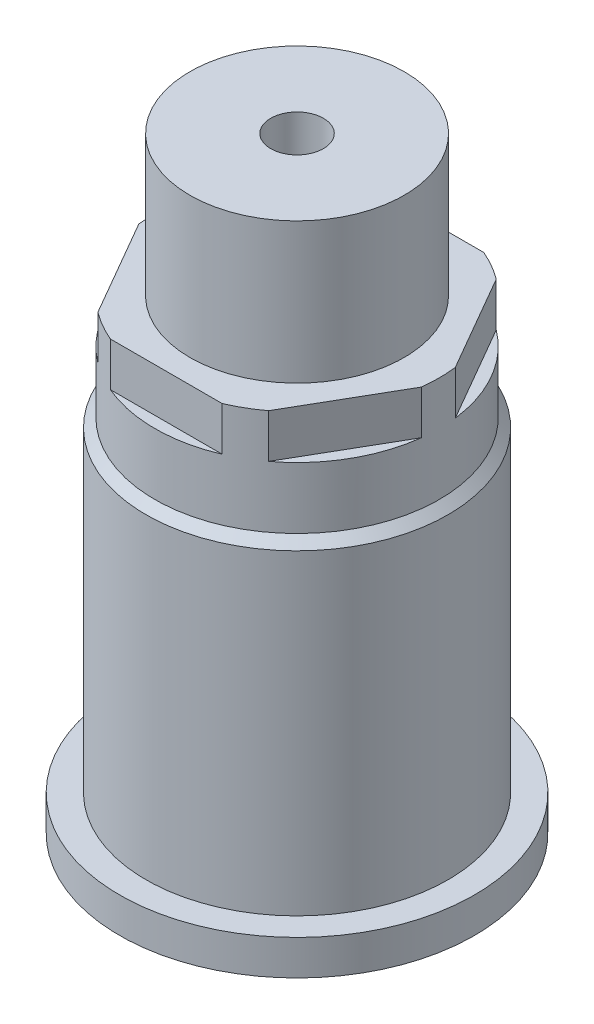
ISO-10303-21;
HEADER;
FILE_DESCRIPTION(('STEP AP214'),'2;1');
FILE_NAME('part.step','',(''),(''),'','','');
FILE_SCHEMA(('AUTOMOTIVE_DESIGN { 1 0 10303 214 1 1 1 1 }'));
ENDSEC;
DATA;
#1=APPLICATION_CONTEXT('core data for automotive mechanical design processes');
#2=APPLICATION_PROTOCOL_DEFINITION('international standard','automotive_design',2000,#1);
#3=PRODUCT_CONTEXT('',#1,'mechanical');
#4=PRODUCT('Part','Part','',(#3));
#5=PRODUCT_RELATED_PRODUCT_CATEGORY('part','',(#4));
#6=PRODUCT_DEFINITION_FORMATION('','',#4);
#7=PRODUCT_DEFINITION_CONTEXT('part definition',#1,'design');
#8=PRODUCT_DEFINITION('design','',#6,#7);
#9=PRODUCT_DEFINITION_SHAPE('','',#8);
#10=(LENGTH_UNIT() NAMED_UNIT(*) SI_UNIT(.MILLI.,.METRE.));
#11=(NAMED_UNIT(*) PLANE_ANGLE_UNIT() SI_UNIT($,.RADIAN.));
#12=(NAMED_UNIT(*) SI_UNIT($,.STERADIAN.) SOLID_ANGLE_UNIT());
#13=UNCERTAINTY_MEASURE_WITH_UNIT(LENGTH_MEASURE(1.E-05),#10,'distance_accuracy_value','');
#14=(GEOMETRIC_REPRESENTATION_CONTEXT(3) GLOBAL_UNCERTAINTY_ASSIGNED_CONTEXT((#13)) GLOBAL_UNIT_ASSIGNED_CONTEXT((#10,
#11,#12)) REPRESENTATION_CONTEXT('',''));
#15=CARTESIAN_POINT('',(0.,0.,0.));
#16=DIRECTION('',(0.,0.,1.));
#17=DIRECTION('',(1.,0.,0.));
#18=AXIS2_PLACEMENT_3D('',#15,#16,#17);
#19=CARTESIAN_POINT('',(0.,0.,0.));
#20=DIRECTION('',(0.,-1.,0.));
#21=DIRECTION('',(0.,0.,-1.));
#22=AXIS2_PLACEMENT_3D('',#19,#20,#21);
#23=CYLINDRICAL_SURFACE('',#22,10.287);
#24=CARTESIAN_POINT('',(0.,24.765,0.));
#25=DIRECTION('',(0.,-1.,0.));
#26=DIRECTION('',(0.,0.,-1.));
#27=AXIS2_PLACEMENT_3D('',#24,#25,#26);
#28=CIRCLE('',#27,10.287);
#29=CARTESIAN_POINT('',(0.,24.765,-10.287));
#30=VERTEX_POINT('',#29);
#31=EDGE_CURVE('E161',#30,#30,#28,.T.);
#32=ORIENTED_EDGE('',*,*,#31,.F.);
#33=EDGE_LOOP('',(#32));
#34=FACE_BOUND('',#33,.T.);
#35=CARTESIAN_POINT('',(0.,29.21,0.));
#36=DIRECTION('',(0.,1.,0.));
#37=DIRECTION('',(0.,0.,1.));
#38=AXIS2_PLACEMENT_3D('',#35,#36,#37);
#39=CIRCLE('',#38,10.287);
#40=CARTESIAN_POINT('',(-10.2135537826675,29.21,-1.22706484284985));
#41=VERTEX_POINT('',#40);
#42=CARTESIAN_POINT('',(-6.16944621733249,29.21,-8.23166461728379));
#43=VERTEX_POINT('',#42);
#44=EDGE_CURVE('E11',#41,#43,#39,.F.);
#45=ORIENTED_EDGE('',*,*,#44,.T.);
#46=DIRECTION('',(0.,-1.,0.));
#47=VECTOR('',#46,1.);
#48=CARTESIAN_POINT('',(-6.16944621733249,0.,-8.23166461728379));
#49=LINE('',#48,#47);
#50=CARTESIAN_POINT('',(-6.16944621733249,32.385,-8.23166461728379));
#51=VERTEX_POINT('',#50);
#52=EDGE_CURVE('E236',#43,#51,#49,.F.);
#53=ORIENTED_EDGE('',*,*,#52,.T.);
#54=CARTESIAN_POINT('',(0.,32.385,0.));
#55=DIRECTION('',(0.,-1.,0.));
#56=DIRECTION('',(0.,0.,-1.));
#57=AXIS2_PLACEMENT_3D('',#54,#55,#56);
#58=CIRCLE('',#57,10.287);
#59=CARTESIAN_POINT('',(-4.04410756533502,32.385,-9.45872946013364));
#60=VERTEX_POINT('',#59);
#61=EDGE_CURVE('E152',#51,#60,#58,.T.);
#62=ORIENTED_EDGE('',*,*,#61,.T.);
#63=DIRECTION('',(0.,-1.,0.));
#64=VECTOR('',#63,1.);
#65=CARTESIAN_POINT('',(-4.04410756533502,0.,-9.45872946013364));
#66=LINE('',#65,#64);
#67=CARTESIAN_POINT('',(-4.04410756533502,29.21,-9.45872946013364));
#68=VERTEX_POINT('',#67);
#69=EDGE_CURVE('E52',#60,#68,#66,.T.);
#70=ORIENTED_EDGE('',*,*,#69,.T.);
#71=CARTESIAN_POINT('',(4.04410756533502,29.21,-9.45872946013364));
#72=VERTEX_POINT('',#71);
#73=EDGE_CURVE('E44',#68,#72,#39,.F.);
#74=ORIENTED_EDGE('',*,*,#73,.T.);
#75=DIRECTION('',(0.,-1.,0.));
#76=VECTOR('',#75,1.);
#77=CARTESIAN_POINT('',(4.04410756533502,0.,-9.45872946013364));
#78=LINE('',#77,#76);
#79=CARTESIAN_POINT('',(4.04410756533502,32.385,-9.45872946013364));
#80=VERTEX_POINT('',#79);
#81=EDGE_CURVE('E207',#72,#80,#78,.F.);
#82=ORIENTED_EDGE('',*,*,#81,.T.);
#83=CARTESIAN_POINT('',(6.16944621733249,32.385,-8.23166461728379));
#84=VERTEX_POINT('',#83);
#85=EDGE_CURVE('E157',#80,#84,#58,.T.);
#86=ORIENTED_EDGE('',*,*,#85,.T.);
#87=DIRECTION('',(0.,-1.,0.));
#88=VECTOR('',#87,1.);
#89=CARTESIAN_POINT('',(6.16944621733249,0.,-8.23166461728379));
#90=LINE('',#89,#88);
#91=CARTESIAN_POINT('',(6.16944621733249,29.21,-8.23166461728379));
#92=VERTEX_POINT('',#91);
#93=EDGE_CURVE('E229',#84,#92,#90,.T.);
#94=ORIENTED_EDGE('',*,*,#93,.T.);
#95=CARTESIAN_POINT('',(10.2135537826675,29.21,-1.22706484284985));
#96=VERTEX_POINT('',#95);
#97=EDGE_CURVE('E199',#92,#96,#39,.F.);
#98=ORIENTED_EDGE('',*,*,#97,.T.);
#99=DIRECTION('',(0.,-1.,0.));
#100=VECTOR('',#99,1.);
#101=CARTESIAN_POINT('',(10.2135537826675,0.,-1.22706484284985));
#102=LINE('',#101,#100);
#103=CARTESIAN_POINT('',(10.2135537826675,32.385,-1.22706484284985));
#104=VERTEX_POINT('',#103);
#105=EDGE_CURVE('E231',#96,#104,#102,.F.);
#106=ORIENTED_EDGE('',*,*,#105,.T.);
#107=CARTESIAN_POINT('',(10.2135537826675,32.385,1.22706484284984));
#108=VERTEX_POINT('',#107);
#109=EDGE_CURVE('E162',#104,#108,#58,.T.);
#110=ORIENTED_EDGE('',*,*,#109,.T.);
#111=DIRECTION('',(0.,-1.,0.));
#112=VECTOR('',#111,1.);
#113=CARTESIAN_POINT('',(10.2135537826675,0.,1.22706484284984));
#114=LINE('',#113,#112);
#115=CARTESIAN_POINT('',(10.2135537826675,29.21,1.22706484284984));
#116=VERTEX_POINT('',#115);
#117=EDGE_CURVE('E225',#108,#116,#114,.T.);
#118=ORIENTED_EDGE('',*,*,#117,.T.);
#119=CARTESIAN_POINT('',(6.16944621733248,29.21,8.23166461728379));
#120=VERTEX_POINT('',#119);
#121=EDGE_CURVE('E195',#116,#120,#39,.F.);
#122=ORIENTED_EDGE('',*,*,#121,.T.);
#123=DIRECTION('',(0.,-1.,0.));
#124=VECTOR('',#123,1.);
#125=CARTESIAN_POINT('',(6.16944621733248,0.,8.23166461728379));
#126=LINE('',#125,#124);
#127=CARTESIAN_POINT('',(6.16944621733249,32.385,8.23166461728379));
#128=VERTEX_POINT('',#127);
#129=EDGE_CURVE('E227',#120,#128,#126,.F.);
#130=ORIENTED_EDGE('',*,*,#129,.T.);
#131=CARTESIAN_POINT('',(4.04410756533502,32.385,9.45872946013364));
#132=VERTEX_POINT('',#131);
#133=EDGE_CURVE('E154',#128,#132,#58,.T.);
#134=ORIENTED_EDGE('',*,*,#133,.T.);
#135=DIRECTION('',(0.,-1.,0.));
#136=VECTOR('',#135,1.);
#137=CARTESIAN_POINT('',(4.04410756533502,0.,9.45872946013364));
#138=LINE('',#137,#136);
#139=CARTESIAN_POINT('',(4.04410756533502,29.21,9.45872946013364));
#140=VERTEX_POINT('',#139);
#141=EDGE_CURVE('E146',#132,#140,#138,.T.);
#142=ORIENTED_EDGE('',*,*,#141,.T.);
#143=CARTESIAN_POINT('',(-4.04410756533503,29.21,9.45872946013364));
#144=VERTEX_POINT('',#143);
#145=EDGE_CURVE('E193',#140,#144,#39,.F.);
#146=ORIENTED_EDGE('',*,*,#145,.T.);
#147=DIRECTION('',(0.,-1.,0.));
#148=VECTOR('',#147,1.);
#149=CARTESIAN_POINT('',(-4.04410756533503,0.,9.45872946013364));
#150=LINE('',#149,#148);
#151=CARTESIAN_POINT('',(-4.04410756533503,32.385,9.45872946013364));
#152=VERTEX_POINT('',#151);
#153=EDGE_CURVE('E223',#144,#152,#150,.F.);
#154=ORIENTED_EDGE('',*,*,#153,.T.);
#155=CARTESIAN_POINT('',(-6.16944621733249,32.385,8.23166461728379));
#156=VERTEX_POINT('',#155);
#157=EDGE_CURVE('E151',#152,#156,#58,.T.);
#158=ORIENTED_EDGE('',*,*,#157,.T.);
#159=DIRECTION('',(0.,-1.,0.));
#160=VECTOR('',#159,1.);
#161=CARTESIAN_POINT('',(-6.16944621733248,0.,8.23166461728379));
#162=LINE('',#161,#160);
#163=CARTESIAN_POINT('',(-6.16944621733248,29.21,8.23166461728379));
#164=VERTEX_POINT('',#163);
#165=EDGE_CURVE('E134',#156,#164,#162,.T.);
#166=ORIENTED_EDGE('',*,*,#165,.T.);
#167=CARTESIAN_POINT('',(-10.2135537826675,29.21,1.22706484284984));
#168=VERTEX_POINT('',#167);
#169=EDGE_CURVE('E45',#164,#168,#39,.F.);
#170=ORIENTED_EDGE('',*,*,#169,.T.);
#171=DIRECTION('',(0.,-1.,0.));
#172=VECTOR('',#171,1.);
#173=CARTESIAN_POINT('',(-10.2135537826675,0.,1.22706484284984));
#174=LINE('',#173,#172);
#175=CARTESIAN_POINT('',(-10.2135537826675,32.385,1.22706484284984));
#176=VERTEX_POINT('',#175);
#177=EDGE_CURVE('E131',#168,#176,#174,.F.);
#178=ORIENTED_EDGE('',*,*,#177,.T.);
#179=CARTESIAN_POINT('',(-10.2135537826675,32.385,-1.22706484284985));
#180=VERTEX_POINT('',#179);
#181=EDGE_CURVE('E145',#176,#180,#58,.T.);
#182=ORIENTED_EDGE('',*,*,#181,.T.);
#183=DIRECTION('',(0.,-1.,0.));
#184=VECTOR('',#183,1.);
#185=CARTESIAN_POINT('',(-10.2135537826675,0.,-1.22706484284985));
#186=LINE('',#185,#184);
#187=EDGE_CURVE('E60',#180,#41,#186,.T.);
#188=ORIENTED_EDGE('',*,*,#187,.T.);
#189=EDGE_LOOP('',(#45,#53,#62,#70,#74,#82,#86,#94,#98,#106,#110,#118,#122,#130,#134,#142,#146,
#154,#158,#166,#170,#178,#182,#188));
#190=FACE_BOUND('',#189,.T.);
#191=ADVANCED_FACE('F35',(#34,#190),#23,.T.);
#192=CARTESIAN_POINT('',(7.747,32.385,0.));
#193=DIRECTION('',(0.,1.,0.));
#194=DIRECTION('',(0.,0.,1.));
#195=AXIS2_PLACEMENT_3D('',#192,#193,#194);
#196=PLANE('',#195);
#197=CARTESIAN_POINT('',(0.,32.385,0.));
#198=DIRECTION('',(0.,-1.,0.));
#199=DIRECTION('',(0.,0.,-1.));
#200=AXIS2_PLACEMENT_3D('',#197,#198,#199);
#201=CIRCLE('',#200,7.747);
#202=CARTESIAN_POINT('',(0.,32.385,-7.747));
#203=VERTEX_POINT('',#202);
#204=EDGE_CURVE('E156',#203,#203,#201,.T.);
#205=ORIENTED_EDGE('',*,*,#204,.T.);
#206=EDGE_LOOP('',(#205));
#207=FACE_BOUND('',#206,.T.);
#208=ORIENTED_EDGE('',*,*,#61,.F.);
#209=DIRECTION('',(-0.5,0.,0.866025403784439));
#210=VECTOR('',#209,1.);
#211=CARTESIAN_POINT('',(-6.25475,32.385,-8.08391413162584));
#212=LINE('',#211,#210);
#213=EDGE_CURVE('E150',#51,#180,#212,.T.);
#214=ORIENTED_EDGE('',*,*,#213,.T.);
#215=ORIENTED_EDGE('',*,*,#181,.F.);
#216=DIRECTION('',(0.5,0.,0.866025403784439));
#217=VECTOR('',#216,1.);
#218=CARTESIAN_POINT('',(-6.25475,32.385,8.08391413162584));
#219=LINE('',#218,#217);
#220=EDGE_CURVE('E127',#176,#156,#219,.T.);
#221=ORIENTED_EDGE('',*,*,#220,.T.);
#222=ORIENTED_EDGE('',*,*,#157,.F.);
#223=DIRECTION('',(1.,0.,0.));
#224=VECTOR('',#223,1.);
#225=CARTESIAN_POINT('',(7.747,32.385,9.45872946013364));
#226=LINE('',#225,#224);
#227=EDGE_CURVE('E139',#152,#132,#226,.T.);
#228=ORIENTED_EDGE('',*,*,#227,.T.);
#229=ORIENTED_EDGE('',*,*,#133,.F.);
#230=DIRECTION('',(0.5,0.,-0.866025403784439));
#231=VECTOR('',#230,1.);
#232=CARTESIAN_POINT('',(10.12825,32.385,1.37481532850779));
#233=LINE('',#232,#231);
#234=EDGE_CURVE('E185',#128,#108,#233,.T.);
#235=ORIENTED_EDGE('',*,*,#234,.T.);
#236=ORIENTED_EDGE('',*,*,#109,.F.);
#237=DIRECTION('',(-0.5,0.,-0.866025403784439));
#238=VECTOR('',#237,1.);
#239=CARTESIAN_POINT('',(10.12825,32.385,-1.3748153285078));
#240=LINE('',#239,#238);
#241=EDGE_CURVE('E188',#104,#84,#240,.T.);
#242=ORIENTED_EDGE('',*,*,#241,.T.);
#243=ORIENTED_EDGE('',*,*,#85,.F.);
#244=DIRECTION('',(-1.,0.,0.));
#245=VECTOR('',#244,1.);
#246=CARTESIAN_POINT('',(7.747,32.385,-9.45872946013364));
#247=LINE('',#246,#245);
#248=EDGE_CURVE('E191',#80,#60,#247,.T.);
#249=ORIENTED_EDGE('',*,*,#248,.T.);
#250=EDGE_LOOP('',(#208,#214,#215,#221,#222,#228,#229,#235,#236,#242,#243,#249));
#251=FACE_BOUND('',#250,.T.);
#252=ADVANCED_FACE('F149',(#207,#251),#196,.T.);
#253=CARTESIAN_POINT('',(0.,0.,0.));
#254=DIRECTION('',(0.,-1.,0.));
#255=DIRECTION('',(0.,0.,-1.));
#256=AXIS2_PLACEMENT_3D('',#253,#254,#255);
#257=PLANE('',#256);
#258=CARTESIAN_POINT('',(0.,0.,0.));
#259=DIRECTION('',(0.,-1.,0.));
#260=DIRECTION('',(0.,0.,-1.));
#261=AXIS2_PLACEMENT_3D('',#258,#259,#260);
#262=CIRCLE('',#261,11.557);
#263=CARTESIAN_POINT('',(0.,0.,-11.557));
#264=VERTEX_POINT('',#263);
#265=EDGE_CURVE('E140',#264,#264,#262,.T.);
#266=ORIENTED_EDGE('',*,*,#265,.T.);
#267=EDGE_LOOP('',(#266));
#268=FACE_BOUND('',#267,.T.);
#269=ADVANCED_FACE('F37',(#268),#257,.T.);
#270=CARTESIAN_POINT('',(0.,0.,0.));
#271=DIRECTION('',(0.,-1.,0.));
#272=DIRECTION('',(0.,0.,-1.));
#273=AXIS2_PLACEMENT_3D('',#270,#271,#272);
#274=CYLINDRICAL_SURFACE('',#273,11.557);
#275=CARTESIAN_POINT('',(0.,-1.27,0.));
#276=DIRECTION('',(0.,-1.,0.));
#277=DIRECTION('',(0.,0.,-1.));
#278=AXIS2_PLACEMENT_3D('',#275,#276,#277);
#279=CIRCLE('',#278,11.557);
#280=CARTESIAN_POINT('',(0.,-1.27,-11.557));
#281=VERTEX_POINT('',#280);
#282=EDGE_CURVE('E178',#281,#281,#279,.T.);
#283=ORIENTED_EDGE('',*,*,#282,.T.);
#284=EDGE_LOOP('',(#283));
#285=FACE_BOUND('',#284,.T.);
#286=ORIENTED_EDGE('',*,*,#265,.F.);
#287=EDGE_LOOP('',(#286));
#288=FACE_BOUND('',#287,.T.);
#289=ADVANCED_FACE('F282',(#285,#288),#274,.F.);
#290=CARTESIAN_POINT('',(11.557,-1.27,0.));
#291=DIRECTION('',(0.,-1.,0.));
#292=DIRECTION('',(0.,0.,-1.));
#293=AXIS2_PLACEMENT_3D('',#290,#291,#292);
#294=PLANE('',#293);
#295=CARTESIAN_POINT('',(0.,-1.27,0.));
#296=DIRECTION('',(0.,-1.,0.));
#297=DIRECTION('',(0.,0.,-1.));
#298=AXIS2_PLACEMENT_3D('',#295,#296,#297);
#299=CIRCLE('',#298,12.827);
#300=CARTESIAN_POINT('',(0.,-1.27,-12.827));
#301=VERTEX_POINT('',#300);
#302=EDGE_CURVE('E175',#301,#301,#299,.T.);
#303=ORIENTED_EDGE('',*,*,#302,.T.);
#304=EDGE_LOOP('',(#303));
#305=FACE_BOUND('',#304,.T.);
#306=ORIENTED_EDGE('',*,*,#282,.F.);
#307=EDGE_LOOP('',(#306));
#308=FACE_BOUND('',#307,.T.);
#309=ADVANCED_FACE('F279',(#305,#308),#294,.T.);
#310=CARTESIAN_POINT('',(0.,0.,0.));
#311=DIRECTION('',(0.,-1.,0.));
#312=DIRECTION('',(0.,0.,-1.));
#313=AXIS2_PLACEMENT_3D('',#310,#311,#312);
#314=CYLINDRICAL_SURFACE('',#313,12.827);
#315=CARTESIAN_POINT('',(0.,1.27,0.));
#316=DIRECTION('',(0.,-1.,0.));
#317=DIRECTION('',(0.,0.,-1.));
#318=AXIS2_PLACEMENT_3D('',#315,#316,#317);
#319=CIRCLE('',#318,12.827);
#320=CARTESIAN_POINT('',(0.,1.27,-12.827));
#321=VERTEX_POINT('',#320);
#322=EDGE_CURVE('E172',#321,#321,#319,.T.);
#323=ORIENTED_EDGE('',*,*,#322,.T.);
#324=EDGE_LOOP('',(#323));
#325=FACE_BOUND('',#324,.T.);
#326=ORIENTED_EDGE('',*,*,#302,.F.);
#327=EDGE_LOOP('',(#326));
#328=FACE_BOUND('',#327,.T.);
#329=ADVANCED_FACE('F275',(#325,#328),#314,.T.);
#330=CARTESIAN_POINT('',(12.827,1.27,0.));
#331=DIRECTION('',(0.,1.,0.));
#332=DIRECTION('',(0.,0.,1.));
#333=AXIS2_PLACEMENT_3D('',#330,#331,#332);
#334=PLANE('',#333);
#335=CARTESIAN_POINT('',(0.,1.27,0.));
#336=DIRECTION('',(0.,-1.,0.));
#337=DIRECTION('',(0.,0.,-1.));
#338=AXIS2_PLACEMENT_3D('',#335,#336,#337);
#339=CIRCLE('',#338,10.922);
#340=CARTESIAN_POINT('',(0.,1.27,-10.922));
#341=VERTEX_POINT('',#340);
#342=EDGE_CURVE('E169',#341,#341,#339,.T.);
#343=ORIENTED_EDGE('',*,*,#342,.T.);
#344=EDGE_LOOP('',(#343));
#345=FACE_BOUND('',#344,.T.);
#346=ORIENTED_EDGE('',*,*,#322,.F.);
#347=EDGE_LOOP('',(#346));
#348=FACE_BOUND('',#347,.T.);
#349=ADVANCED_FACE('F271',(#345,#348),#334,.T.);
#350=CARTESIAN_POINT('',(0.,0.,0.));
#351=DIRECTION('',(0.,-1.,0.));
#352=DIRECTION('',(0.,0.,-1.));
#353=AXIS2_PLACEMENT_3D('',#350,#351,#352);
#354=CYLINDRICAL_SURFACE('',#353,10.922);
#355=CARTESIAN_POINT('',(0.,24.13,0.));
#356=DIRECTION('',(0.,-1.,0.));
#357=DIRECTION('',(0.,0.,-1.));
#358=AXIS2_PLACEMENT_3D('',#355,#356,#357);
#359=CIRCLE('',#358,10.922);
#360=CARTESIAN_POINT('',(0.,24.13,-10.922));
#361=VERTEX_POINT('',#360);
#362=EDGE_CURVE('E166',#361,#361,#359,.T.);
#363=ORIENTED_EDGE('',*,*,#362,.T.);
#364=EDGE_LOOP('',(#363));
#365=FACE_BOUND('',#364,.T.);
#366=ORIENTED_EDGE('',*,*,#342,.F.);
#367=EDGE_LOOP('',(#366));
#368=FACE_BOUND('',#367,.T.);
#369=ADVANCED_FACE('F257',(#365,#368),#354,.T.);
#370=CARTESIAN_POINT('',(0.,24.13,0.));
#371=DIRECTION('',(0.,-1.,0.));
#372=DIRECTION('',(0.,0.,-1.));
#373=AXIS2_PLACEMENT_3D('',#370,#371,#372);
#374=CONICAL_SURFACE('',#373,10.922,0.78539816339745);
#375=ORIENTED_EDGE('',*,*,#31,.T.);
#376=EDGE_LOOP('',(#375));
#377=FACE_BOUND('',#376,.T.);
#378=ORIENTED_EDGE('',*,*,#362,.F.);
#379=EDGE_LOOP('',(#378));
#380=FACE_BOUND('',#379,.T.);
#381=ADVANCED_FACE('F249',(#377,#380),#374,.T.);
#382=CARTESIAN_POINT('',(0.,0.,0.));
#383=DIRECTION('',(0.,-1.,0.));
#384=DIRECTION('',(0.,0.,-1.));
#385=AXIS2_PLACEMENT_3D('',#382,#383,#384);
#386=CYLINDRICAL_SURFACE('',#385,7.747);
#387=CARTESIAN_POINT('',(0.,42.545,0.));
#388=DIRECTION('',(0.,-1.,0.));
#389=DIRECTION('',(0.,0.,-1.));
#390=AXIS2_PLACEMENT_3D('',#387,#388,#389);
#391=CIRCLE('',#390,7.747);
#392=CARTESIAN_POINT('',(0.,42.545,-7.747));
#393=VERTEX_POINT('',#392);
#394=EDGE_CURVE('E238',#393,#393,#391,.T.);
#395=ORIENTED_EDGE('',*,*,#394,.T.);
#396=EDGE_LOOP('',(#395));
#397=FACE_BOUND('',#396,.T.);
#398=ORIENTED_EDGE('',*,*,#204,.F.);
#399=EDGE_LOOP('',(#398));
#400=FACE_BOUND('',#399,.T.);
#401=ADVANCED_FACE('F246',(#397,#400),#386,.T.);
#402=CARTESIAN_POINT('',(7.747,42.545,0.));
#403=DIRECTION('',(0.,1.,0.));
#404=DIRECTION('',(0.,0.,1.));
#405=AXIS2_PLACEMENT_3D('',#402,#403,#404);
#406=PLANE('',#405);
#407=CARTESIAN_POINT('',(0.,42.545,0.));
#408=DIRECTION('',(0.,1.,0.));
#409=DIRECTION('',(0.,0.,1.));
#410=AXIS2_PLACEMENT_3D('',#407,#408,#409);
#411=CIRCLE('',#410,1.905);
#412=CARTESIAN_POINT('',(0.,42.545,-1.905));
#413=VERTEX_POINT('',#412);
#414=EDGE_CURVE('E39',#413,#413,#411,.F.);
#415=ORIENTED_EDGE('',*,*,#414,.T.);
#416=EDGE_LOOP('',(#415));
#417=FACE_BOUND('',#416,.T.);
#418=ORIENTED_EDGE('',*,*,#394,.F.);
#419=EDGE_LOOP('',(#418));
#420=FACE_BOUND('',#419,.T.);
#421=ADVANCED_FACE('F248',(#417,#420),#406,.T.);
#422=CARTESIAN_POINT('',(-10.922,29.21,0.));
#423=DIRECTION('',(-0.866025403784439,0.,0.5));
#424=DIRECTION('',(0.5,0.,0.866025403784439));
#425=AXIS2_PLACEMENT_3D('',#422,#423,#424);
#426=PLANE('',#425);
#427=DIRECTION('',(0.5,0.,0.866025403784439));
#428=VECTOR('',#427,1.);
#429=CARTESIAN_POINT('',(-10.922,29.21,0.));
#430=LINE('',#429,#428);
#431=EDGE_CURVE('E505',#168,#164,#430,.T.);
#432=ORIENTED_EDGE('',*,*,#431,.T.);
#433=ORIENTED_EDGE('',*,*,#165,.F.);
#434=ORIENTED_EDGE('',*,*,#220,.F.);
#435=ORIENTED_EDGE('',*,*,#177,.F.);
#436=EDGE_LOOP('',(#432,#433,#434,#435));
#437=FACE_BOUND('',#436,.T.);
#438=ADVANCED_FACE('F130',(#437),#426,.T.);
#439=CARTESIAN_POINT('',(0.,29.21,0.));
#440=DIRECTION('',(0.,1.,0.));
#441=DIRECTION('',(0.,0.,1.));
#442=AXIS2_PLACEMENT_3D('',#439,#440,#441);
#443=PLANE('',#442);
#444=ORIENTED_EDGE('',*,*,#431,.F.);
#445=ORIENTED_EDGE('',*,*,#169,.F.);
#446=EDGE_LOOP('',(#444,#445));
#447=FACE_BOUND('',#446,.T.);
#448=ADVANCED_FACE('F375',(#447),#443,.T.);
#449=CARTESIAN_POINT('',(-5.461,29.21,9.45872946013364));
#450=DIRECTION('',(0.,0.,1.));
#451=DIRECTION('',(1.,0.,0.));
#452=AXIS2_PLACEMENT_3D('',#449,#450,#451);
#453=PLANE('',#452);
#454=DIRECTION('',(1.,0.,0.));
#455=VECTOR('',#454,1.);
#456=CARTESIAN_POINT('',(-5.461,29.21,9.45872946013364));
#457=LINE('',#456,#455);
#458=EDGE_CURVE('E507',#144,#140,#457,.T.);
#459=ORIENTED_EDGE('',*,*,#458,.T.);
#460=ORIENTED_EDGE('',*,*,#141,.F.);
#461=ORIENTED_EDGE('',*,*,#227,.F.);
#462=ORIENTED_EDGE('',*,*,#153,.F.);
#463=EDGE_LOOP('',(#459,#460,#461,#462));
#464=FACE_BOUND('',#463,.T.);
#465=ADVANCED_FACE('F383',(#464),#453,.T.);
#466=ORIENTED_EDGE('',*,*,#458,.F.);
#467=ORIENTED_EDGE('',*,*,#145,.F.);
#468=EDGE_LOOP('',(#466,#467));
#469=FACE_BOUND('',#468,.T.);
#470=ADVANCED_FACE('F387',(#469),#443,.T.);
#471=CARTESIAN_POINT('',(5.461,29.21,9.45872946013364));
#472=DIRECTION('',(0.866025403784439,0.,0.5));
#473=DIRECTION('',(0.5,0.,-0.866025403784439));
#474=AXIS2_PLACEMENT_3D('',#471,#472,#473);
#475=PLANE('',#474);
#476=DIRECTION('',(0.5,0.,-0.866025403784439));
#477=VECTOR('',#476,1.);
#478=CARTESIAN_POINT('',(5.461,29.21,9.45872946013364));
#479=LINE('',#478,#477);
#480=EDGE_CURVE('E218',#120,#116,#479,.T.);
#481=ORIENTED_EDGE('',*,*,#480,.T.);
#482=ORIENTED_EDGE('',*,*,#117,.F.);
#483=ORIENTED_EDGE('',*,*,#234,.F.);
#484=ORIENTED_EDGE('',*,*,#129,.F.);
#485=EDGE_LOOP('',(#481,#482,#483,#484));
#486=FACE_BOUND('',#485,.T.);
#487=ADVANCED_FACE('F402',(#486),#475,.T.);
#488=ORIENTED_EDGE('',*,*,#480,.F.);
#489=ORIENTED_EDGE('',*,*,#121,.F.);
#490=EDGE_LOOP('',(#488,#489));
#491=FACE_BOUND('',#490,.T.);
#492=ADVANCED_FACE('F404',(#491),#443,.T.);
#493=CARTESIAN_POINT('',(10.922,29.21,0.));
#494=DIRECTION('',(0.866025403784439,0.,-0.5));
#495=DIRECTION('',(-0.5,0.,-0.866025403784439));
#496=AXIS2_PLACEMENT_3D('',#493,#494,#495);
#497=PLANE('',#496);
#498=DIRECTION('',(-0.5,0.,-0.866025403784439));
#499=VECTOR('',#498,1.);
#500=CARTESIAN_POINT('',(10.922,29.21,0.));
#501=LINE('',#500,#499);
#502=EDGE_CURVE('E214',#96,#92,#501,.T.);
#503=ORIENTED_EDGE('',*,*,#502,.T.);
#504=ORIENTED_EDGE('',*,*,#93,.F.);
#505=ORIENTED_EDGE('',*,*,#241,.F.);
#506=ORIENTED_EDGE('',*,*,#105,.F.);
#507=EDGE_LOOP('',(#503,#504,#505,#506));
#508=FACE_BOUND('',#507,.T.);
#509=ADVANCED_FACE('F419',(#508),#497,.T.);
#510=ORIENTED_EDGE('',*,*,#502,.F.);
#511=ORIENTED_EDGE('',*,*,#97,.F.);
#512=EDGE_LOOP('',(#510,#511));
#513=FACE_BOUND('',#512,.T.);
#514=ADVANCED_FACE('F421',(#513),#443,.T.);
#515=CARTESIAN_POINT('',(5.461,29.21,-9.45872946013364));
#516=DIRECTION('',(0.,0.,-1.));
#517=DIRECTION('',(-1.,0.,0.));
#518=AXIS2_PLACEMENT_3D('',#515,#516,#517);
#519=PLANE('',#518);
#520=DIRECTION('',(-1.,0.,0.));
#521=VECTOR('',#520,1.);
#522=CARTESIAN_POINT('',(5.461,29.21,-9.45872946013364));
#523=LINE('',#522,#521);
#524=EDGE_CURVE('E212',#72,#68,#523,.T.);
#525=ORIENTED_EDGE('',*,*,#524,.T.);
#526=ORIENTED_EDGE('',*,*,#69,.F.);
#527=ORIENTED_EDGE('',*,*,#248,.F.);
#528=ORIENTED_EDGE('',*,*,#81,.F.);
#529=EDGE_LOOP('',(#525,#526,#527,#528));
#530=FACE_BOUND('',#529,.T.);
#531=ADVANCED_FACE('F213',(#530),#519,.T.);
#532=ORIENTED_EDGE('',*,*,#524,.F.);
#533=ORIENTED_EDGE('',*,*,#73,.F.);
#534=EDGE_LOOP('',(#532,#533));
#535=FACE_BOUND('',#534,.T.);
#536=ADVANCED_FACE('F211',(#535),#443,.T.);
#537=DIRECTION('',(-0.5,0.,0.866025403784439));
#538=VECTOR('',#537,1.);
#539=CARTESIAN_POINT('',(-5.461,29.21,-9.45872946013364));
#540=LINE('',#539,#538);
#541=EDGE_CURVE('E502',#43,#41,#540,.T.);
#542=ORIENTED_EDGE('',*,*,#541,.F.);
#543=ORIENTED_EDGE('',*,*,#44,.F.);
#544=EDGE_LOOP('',(#542,#543));
#545=FACE_BOUND('',#544,.T.);
#546=ADVANCED_FACE('F386',(#545),#443,.T.);
#547=CARTESIAN_POINT('',(-5.461,29.21,-9.45872946013364));
#548=DIRECTION('',(-0.866025403784439,0.,-0.5));
#549=DIRECTION('',(-0.5,0.,0.866025403784439));
#550=AXIS2_PLACEMENT_3D('',#547,#548,#549);
#551=PLANE('',#550);
#552=ORIENTED_EDGE('',*,*,#541,.T.);
#553=ORIENTED_EDGE('',*,*,#187,.F.);
#554=ORIENTED_EDGE('',*,*,#213,.F.);
#555=ORIENTED_EDGE('',*,*,#52,.F.);
#556=EDGE_LOOP('',(#552,#553,#554,#555));
#557=FACE_BOUND('',#556,.T.);
#558=ADVANCED_FACE('F456',(#557),#551,.T.);
#559=CARTESIAN_POINT('',(0.,42.545012,0.));
#560=DIRECTION('',(0.,-1.,0.));
#561=DIRECTION('',(0.,0.,-1.));
#562=AXIS2_PLACEMENT_3D('',#559,#560,#561);
#563=CYLINDRICAL_SURFACE('',#562,1.905);
#564=CARTESIAN_POINT('',(0.,9.525,0.));
#565=DIRECTION('',(0.,1.,0.));
#566=DIRECTION('',(0.,0.,1.));
#567=AXIS2_PLACEMENT_3D('',#564,#565,#566);
#568=CIRCLE('',#567,1.905);
#569=CARTESIAN_POINT('',(0.,9.52499999999999,-1.905));
#570=VERTEX_POINT('',#569);
#571=EDGE_CURVE('E498',#570,#570,#568,.T.);
#572=CARTESIAN_POINT('',(0.,42.545,-1.905));
#573=CARTESIAN_POINT('',(0.,42.2010416666667,-1.905));
#574=CARTESIAN_POINT('',(0.,41.8570833333333,-1.905));
#575=CARTESIAN_POINT('',(0.,41.1691666666667,-1.905));
#576=CARTESIAN_POINT('',(0.,40.8252083333333,-1.905));
#577=CARTESIAN_POINT('',(0.,40.1372916666667,-1.905));
#578=CARTESIAN_POINT('',(0.,39.7933333333333,-1.905));
#579=CARTESIAN_POINT('',(0.,39.1054166666667,-1.905));
#580=CARTESIAN_POINT('',(0.,38.7614583333333,-1.905));
#581=CARTESIAN_POINT('',(0.,38.0735416666667,-1.905));
#582=CARTESIAN_POINT('',(0.,37.7295833333333,-1.905));
#583=CARTESIAN_POINT('',(0.,37.0416666666667,-1.905));
#584=CARTESIAN_POINT('',(0.,36.6977083333333,-1.905));
#585=CARTESIAN_POINT('',(0.,36.0097916666667,-1.905));
#586=CARTESIAN_POINT('',(0.,35.6658333333333,-1.905));
#587=CARTESIAN_POINT('',(0.,34.9779166666667,-1.905));
#588=CARTESIAN_POINT('',(0.,34.6339583333333,-1.905));
#589=CARTESIAN_POINT('',(0.,33.9460416666667,-1.905));
#590=CARTESIAN_POINT('',(0.,33.6020833333333,-1.905));
#591=CARTESIAN_POINT('',(0.,32.9141666666667,-1.905));
#592=CARTESIAN_POINT('',(0.,32.5702083333333,-1.905));
#593=CARTESIAN_POINT('',(0.,31.8822916666667,-1.905));
#594=CARTESIAN_POINT('',(0.,31.5383333333333,-1.905));
#595=CARTESIAN_POINT('',(0.,30.8504166666667,-1.905));
#596=CARTESIAN_POINT('',(0.,30.5064583333333,-1.905));
#597=CARTESIAN_POINT('',(0.,29.8185416666667,-1.905));
#598=CARTESIAN_POINT('',(0.,29.4745833333333,-1.905));
#599=CARTESIAN_POINT('',(0.,28.7866666666667,-1.905));
#600=CARTESIAN_POINT('',(0.,28.4427083333333,-1.905));
#601=CARTESIAN_POINT('',(0.,27.7547916666667,-1.905));
#602=CARTESIAN_POINT('',(0.,27.4108333333333,-1.905));
#603=CARTESIAN_POINT('',(0.,26.7229166666667,-1.905));
#604=CARTESIAN_POINT('',(0.,26.3789583333333,-1.905));
#605=CARTESIAN_POINT('',(0.,25.6910416666667,-1.905));
#606=CARTESIAN_POINT('',(0.,25.3470833333333,-1.905));
#607=CARTESIAN_POINT('',(0.,24.6591666666667,-1.905));
#608=CARTESIAN_POINT('',(0.,24.3152083333333,-1.905));
#609=CARTESIAN_POINT('',(0.,23.6272916666667,-1.905));
#610=CARTESIAN_POINT('',(0.,23.2833333333333,-1.905));
#611=CARTESIAN_POINT('',(0.,22.5954166666667,-1.905));
#612=CARTESIAN_POINT('',(0.,22.2514583333333,-1.905));
#613=CARTESIAN_POINT('',(0.,21.5635416666667,-1.905));
#614=CARTESIAN_POINT('',(0.,21.2195833333333,-1.905));
#615=CARTESIAN_POINT('',(0.,20.5316666666667,-1.905));
#616=CARTESIAN_POINT('',(0.,20.1877083333333,-1.905));
#617=CARTESIAN_POINT('',(0.,19.4997916666667,-1.905));
#618=CARTESIAN_POINT('',(0.,19.1558333333333,-1.905));
#619=CARTESIAN_POINT('',(0.,18.4679166666667,-1.905));
#620=CARTESIAN_POINT('',(0.,18.1239583333333,-1.905));
#621=CARTESIAN_POINT('',(0.,17.4360416666667,-1.905));
#622=CARTESIAN_POINT('',(0.,17.0920833333333,-1.905));
#623=CARTESIAN_POINT('',(0.,16.4041666666667,-1.905));
#624=CARTESIAN_POINT('',(0.,16.0602083333333,-1.905));
#625=CARTESIAN_POINT('',(0.,15.3722916666667,-1.905));
#626=CARTESIAN_POINT('',(0.,15.0283333333333,-1.905));
#627=CARTESIAN_POINT('',(0.,14.3404166666667,-1.905));
#628=CARTESIAN_POINT('',(0.,13.9964583333333,-1.905));
#629=CARTESIAN_POINT('',(0.,13.3085416666667,-1.905));
#630=CARTESIAN_POINT('',(0.,12.9645833333333,-1.905));
#631=CARTESIAN_POINT('',(0.,12.2766666666667,-1.905));
#632=CARTESIAN_POINT('',(0.,11.9327083333333,-1.905));
#633=CARTESIAN_POINT('',(0.,11.2447916666667,-1.905));
#634=CARTESIAN_POINT('',(0.,10.9008333333333,-1.905));
#635=CARTESIAN_POINT('',(0.,10.2129166666667,-1.905));
#636=CARTESIAN_POINT('',(0.,9.86895833333332,-1.905));
#637=CARTESIAN_POINT('',(0.,9.52499999999999,-1.905));
#638=B_SPLINE_CURVE_WITH_KNOTS('',3,(#572,#573,#574,#575,#576,#577,#578,#579,#580,#581,#582,
#583,#584,#585,#586,#587,#588,#589,#590,#591,#592,#593,#594,#595,#596,#597,#598,#599,#600,#601,
#602,#603,#604,#605,#606,#607,#608,#609,#610,#611,#612,#613,#614,#615,#616,#617,#618,#619,#620,
#621,#622,#623,#624,#625,#626,#627,#628,#629,#630,#631,#632,#633,#634,#635,#636,#637),
.UNSPECIFIED.,.F.,.F.,(4,2,2,2,2,2,2,2,2,2,2,2,2,2,2,2,2,2,2,2,2,2,2,2,2,2,2,2,2,2,2,2,4),(0.,
1.03187499999999,2.06375,3.095625,4.1275,5.15937499999999,6.19125,7.223125,8.255,
9.28687499999999,10.31875,11.350625,12.3825,13.414375,14.44625,15.478125,16.51,17.541875,
18.57375,19.605625,20.6375,21.669375,22.70125,23.733125,24.765,25.796875,26.82875,27.860625,
28.8925,29.924375,30.95625,31.988125,33.02),.UNSPECIFIED.);
#639=EDGE_CURVE('BSEAM463',#413,#570,#638,.T.);
#640=ORIENTED_EDGE('',*,*,#414,.F.);
#641=ORIENTED_EDGE('',*,*,#571,.F.);
#642=ORIENTED_EDGE('',*,*,#639,.T.);
#643=ORIENTED_EDGE('',*,*,#639,.F.);
#644=EDGE_LOOP('',(#640,#642,#641,#643));
#645=FACE_BOUND('',#644,.T.);
#646=ADVANCED_FACE('F463',(#645),#563,.F.);
#647=CARTESIAN_POINT('',(0.,9.525,0.));
#648=DIRECTION('',(0.,1.,0.));
#649=DIRECTION('',(0.,0.,1.));
#650=AXIS2_PLACEMENT_3D('',#647,#648,#649);
#651=PLANE('',#650);
#652=ORIENTED_EDGE('',*,*,#571,.T.);
#653=EDGE_LOOP('',(#652));
#654=FACE_BOUND('',#653,.T.);
#655=ADVANCED_FACE('F470',(#654),#651,.T.);
#656=CLOSED_SHELL('',(#191,#252,#269,#289,#309,#329,#349,#369,#381,#401,#421,#438,#448,#465,
#470,#487,#492,#509,#514,#531,#536,#546,#558,#646,#655));
#657=MANIFOLD_SOLID_BREP('B2',#656);
#658=ADVANCED_BREP_SHAPE_REPRESENTATION('',(#18,#657),#14);
#659=SHAPE_DEFINITION_REPRESENTATION(#9,#658);
ENDSEC;
END-ISO-10303-21;
